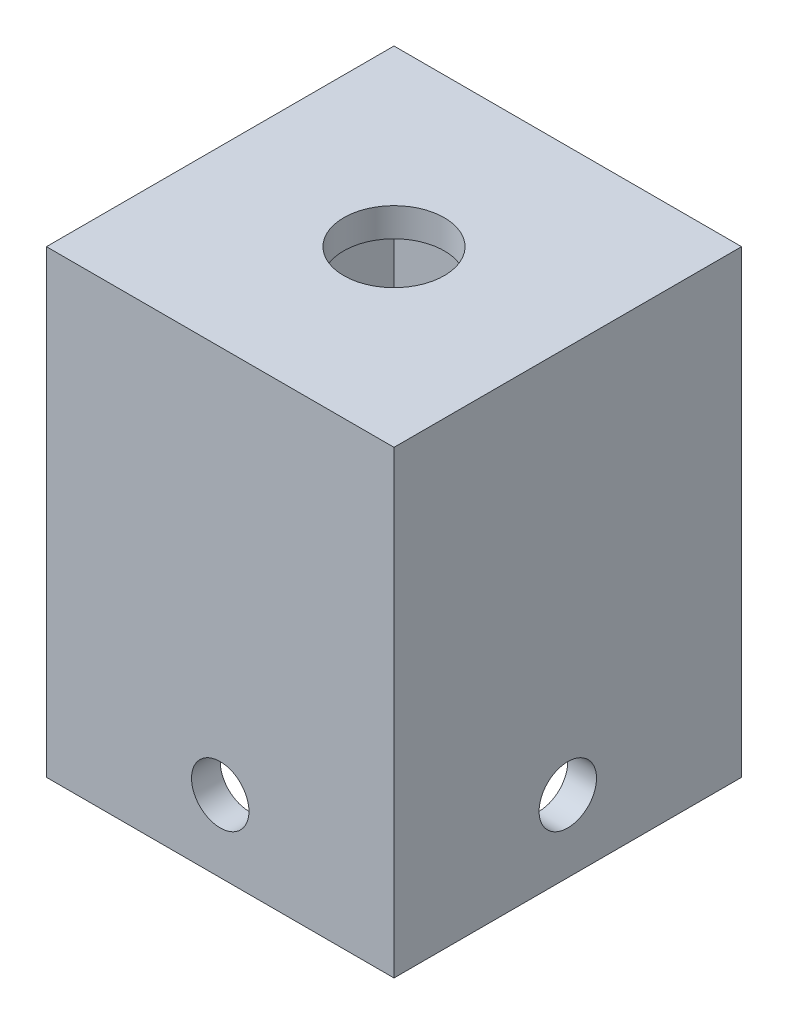
ISO-10303-21;
HEADER;
FILE_DESCRIPTION(('STEP AP214'),'2;1');
FILE_NAME('part.step','',(''),(''),'','','');
FILE_SCHEMA(('AUTOMOTIVE_DESIGN { 1 0 10303 214 1 1 1 1 }'));
ENDSEC;
DATA;
#1=APPLICATION_CONTEXT('core data for automotive mechanical design processes');
#2=APPLICATION_PROTOCOL_DEFINITION('international standard','automotive_design',2000,#1);
#3=PRODUCT_CONTEXT('',#1,'mechanical');
#4=PRODUCT('Part','Part','',(#3));
#5=PRODUCT_RELATED_PRODUCT_CATEGORY('part','',(#4));
#6=PRODUCT_DEFINITION_FORMATION('','',#4);
#7=PRODUCT_DEFINITION_CONTEXT('part definition',#1,'design');
#8=PRODUCT_DEFINITION('design','',#6,#7);
#9=PRODUCT_DEFINITION_SHAPE('','',#8);
#10=(LENGTH_UNIT() NAMED_UNIT(*) SI_UNIT(.MILLI.,.METRE.));
#11=(NAMED_UNIT(*) PLANE_ANGLE_UNIT() SI_UNIT($,.RADIAN.));
#12=(NAMED_UNIT(*) SI_UNIT($,.STERADIAN.) SOLID_ANGLE_UNIT());
#13=UNCERTAINTY_MEASURE_WITH_UNIT(LENGTH_MEASURE(1.E-05),#10,'distance_accuracy_value','');
#14=(GEOMETRIC_REPRESENTATION_CONTEXT(3) GLOBAL_UNCERTAINTY_ASSIGNED_CONTEXT((#13)) GLOBAL_UNIT_ASSIGNED_CONTEXT((#10,
#11,#12)) REPRESENTATION_CONTEXT('',''));
#15=CARTESIAN_POINT('',(0.,0.,0.));
#16=DIRECTION('',(0.,0.,1.));
#17=DIRECTION('',(1.,0.,0.));
#18=AXIS2_PLACEMENT_3D('',#15,#16,#17);
#19=CARTESIAN_POINT('',(0.,0.,0.));
#20=DIRECTION('',(0.,-1.,0.));
#21=DIRECTION('',(0.,0.,-1.));
#22=AXIS2_PLACEMENT_3D('',#19,#20,#21);
#23=PLANE('',#22);
#24=DIRECTION('',(0.,0.,1.));
#25=VECTOR('',#24,1.);
#26=CARTESIAN_POINT('',(-12.1,0.,-12.1));
#27=LINE('',#26,#25);
#28=CARTESIAN_POINT('',(-12.1,0.,-12.1));
#29=VERTEX_POINT('',#28);
#30=CARTESIAN_POINT('',(-12.1,0.,12.1));
#31=VERTEX_POINT('',#30);
#32=EDGE_CURVE('E111',#29,#31,#27,.T.);
#33=ORIENTED_EDGE('',*,*,#32,.F.);
#34=DIRECTION('',(-1.,0.,0.));
#35=VECTOR('',#34,1.);
#36=CARTESIAN_POINT('',(12.1,0.,-12.1));
#37=LINE('',#36,#35);
#38=CARTESIAN_POINT('',(12.1,0.,-12.1));
#39=VERTEX_POINT('',#38);
#40=EDGE_CURVE('E62',#39,#29,#37,.T.);
#41=ORIENTED_EDGE('',*,*,#40,.F.);
#42=DIRECTION('',(0.,0.,-1.));
#43=VECTOR('',#42,1.);
#44=CARTESIAN_POINT('',(12.1,0.,-12.1));
#45=LINE('',#44,#43);
#46=CARTESIAN_POINT('',(12.1,0.,12.1));
#47=VERTEX_POINT('',#46);
#48=EDGE_CURVE('E188',#47,#39,#45,.T.);
#49=ORIENTED_EDGE('',*,*,#48,.F.);
#50=DIRECTION('',(1.,0.,0.));
#51=VECTOR('',#50,1.);
#52=CARTESIAN_POINT('',(12.1,0.,12.1));
#53=LINE('',#52,#51);
#54=EDGE_CURVE('E186',#31,#47,#53,.T.);
#55=ORIENTED_EDGE('',*,*,#54,.F.);
#56=EDGE_LOOP('',(#33,#41,#49,#55));
#57=FACE_BOUND('',#56,.T.);
#58=DIRECTION('',(-1.,0.,0.));
#59=VECTOR('',#58,1.);
#60=CARTESIAN_POINT('',(10.1,0.,-10.1));
#61=LINE('',#60,#59);
#62=CARTESIAN_POINT('',(10.1,0.,-10.1));
#63=VERTEX_POINT('',#62);
#64=CARTESIAN_POINT('',(-10.1,0.,-10.1));
#65=VERTEX_POINT('',#64);
#66=EDGE_CURVE('E159',#63,#65,#61,.T.);
#67=ORIENTED_EDGE('',*,*,#66,.T.);
#68=DIRECTION('',(0.,0.,1.));
#69=VECTOR('',#68,1.);
#70=CARTESIAN_POINT('',(-10.1,0.,-10.1));
#71=LINE('',#70,#69);
#72=CARTESIAN_POINT('',(-10.1,0.,10.1));
#73=VERTEX_POINT('',#72);
#74=EDGE_CURVE('E54',#65,#73,#71,.T.);
#75=ORIENTED_EDGE('',*,*,#74,.T.);
#76=DIRECTION('',(1.,0.,0.));
#77=VECTOR('',#76,1.);
#78=CARTESIAN_POINT('',(10.1,0.,10.1));
#79=LINE('',#78,#77);
#80=CARTESIAN_POINT('',(10.1,0.,10.1));
#81=VERTEX_POINT('',#80);
#82=EDGE_CURVE('E170',#73,#81,#79,.T.);
#83=ORIENTED_EDGE('',*,*,#82,.T.);
#84=DIRECTION('',(0.,0.,-1.));
#85=VECTOR('',#84,1.);
#86=CARTESIAN_POINT('',(10.1,0.,-10.1));
#87=LINE('',#86,#85);
#88=EDGE_CURVE('E173',#81,#63,#87,.T.);
#89=ORIENTED_EDGE('',*,*,#88,.T.);
#90=EDGE_LOOP('',(#67,#75,#83,#89));
#91=FACE_BOUND('',#90,.T.);
#92=ADVANCED_FACE('F37',(#57,#91),#23,.T.);
#93=CARTESIAN_POINT('',(-12.1,30.,-12.1));
#94=DIRECTION('',(1.,0.,0.));
#95=DIRECTION('',(0.,0.,-1.));
#96=AXIS2_PLACEMENT_3D('',#93,#94,#95);
#97=PLANE('',#96);
#98=CARTESIAN_POINT('',(-12.1,5.,0.));
#99=DIRECTION('',(1.,0.,0.));
#100=DIRECTION('',(0.,0.,-1.));
#101=AXIS2_PLACEMENT_3D('',#98,#99,#100);
#102=CIRCLE('',#101,2.);
#103=CARTESIAN_POINT('',(-12.1,5.,-2.));
#104=VERTEX_POINT('',#103);
#105=EDGE_CURVE('E142',#104,#104,#102,.T.);
#106=ORIENTED_EDGE('',*,*,#105,.T.);
#107=EDGE_LOOP('',(#106));
#108=FACE_BOUND('',#107,.T.);
#109=ORIENTED_EDGE('',*,*,#32,.T.);
#110=DIRECTION('',(0.,-1.,0.));
#111=VECTOR('',#110,1.);
#112=CARTESIAN_POINT('',(-12.1,30.,12.1));
#113=LINE('',#112,#111);
#114=CARTESIAN_POINT('',(-12.1,32.,12.1));
#115=VERTEX_POINT('',#114);
#116=EDGE_CURVE('E11',#115,#31,#113,.T.);
#117=ORIENTED_EDGE('',*,*,#116,.F.);
#118=DIRECTION('',(0.,0.,1.));
#119=VECTOR('',#118,1.);
#120=CARTESIAN_POINT('',(-12.1,32.,-12.1));
#121=LINE('',#120,#119);
#122=CARTESIAN_POINT('',(-12.1,32.,-12.1));
#123=VERTEX_POINT('',#122);
#124=EDGE_CURVE('E109',#123,#115,#121,.T.);
#125=ORIENTED_EDGE('',*,*,#124,.F.);
#126=DIRECTION('',(0.,-1.,0.));
#127=VECTOR('',#126,1.);
#128=CARTESIAN_POINT('',(-12.1,30.,-12.1));
#129=LINE('',#128,#127);
#130=EDGE_CURVE('E191',#123,#29,#129,.T.);
#131=ORIENTED_EDGE('',*,*,#130,.T.);
#132=EDGE_LOOP('',(#109,#117,#125,#131));
#133=FACE_BOUND('',#132,.T.);
#134=ADVANCED_FACE('F39',(#108,#133),#97,.F.);
#135=CARTESIAN_POINT('',(12.1,30.,12.1));
#136=DIRECTION('',(0.,0.,-1.));
#137=DIRECTION('',(-1.,0.,0.));
#138=AXIS2_PLACEMENT_3D('',#135,#136,#137);
#139=PLANE('',#138);
#140=CARTESIAN_POINT('',(0.,5.,12.1));
#141=DIRECTION('',(0.,0.,1.));
#142=DIRECTION('',(1.,0.,0.));
#143=AXIS2_PLACEMENT_3D('',#140,#141,#142);
#144=CIRCLE('',#143,2.);
#145=CARTESIAN_POINT('',(2.,5.,12.1));
#146=VERTEX_POINT('',#145);
#147=EDGE_CURVE('E145',#146,#146,#144,.T.);
#148=ORIENTED_EDGE('',*,*,#147,.F.);
#149=EDGE_LOOP('',(#148));
#150=FACE_BOUND('',#149,.T.);
#151=ORIENTED_EDGE('',*,*,#54,.T.);
#152=DIRECTION('',(0.,-1.,0.));
#153=VECTOR('',#152,1.);
#154=CARTESIAN_POINT('',(12.1,30.,12.1));
#155=LINE('',#154,#153);
#156=CARTESIAN_POINT('',(12.1,32.,12.1));
#157=VERTEX_POINT('',#156);
#158=EDGE_CURVE('E46',#157,#47,#155,.T.);
#159=ORIENTED_EDGE('',*,*,#158,.F.);
#160=DIRECTION('',(1.,0.,0.));
#161=VECTOR('',#160,1.);
#162=CARTESIAN_POINT('',(12.1,32.,12.1));
#163=LINE('',#162,#161);
#164=EDGE_CURVE('E114',#115,#157,#163,.T.);
#165=ORIENTED_EDGE('',*,*,#164,.F.);
#166=ORIENTED_EDGE('',*,*,#116,.T.);
#167=EDGE_LOOP('',(#151,#159,#165,#166));
#168=FACE_BOUND('',#167,.T.);
#169=ADVANCED_FACE('F115',(#150,#168),#139,.F.);
#170=CARTESIAN_POINT('',(12.1,30.,-12.1));
#171=DIRECTION('',(-1.,0.,0.));
#172=DIRECTION('',(0.,0.,1.));
#173=AXIS2_PLACEMENT_3D('',#170,#171,#172);
#174=PLANE('',#173);
#175=CARTESIAN_POINT('',(12.1,5.,0.));
#176=DIRECTION('',(1.,0.,0.));
#177=DIRECTION('',(0.,0.,-1.));
#178=AXIS2_PLACEMENT_3D('',#175,#176,#177);
#179=CIRCLE('',#178,2.);
#180=CARTESIAN_POINT('',(12.1,5.,-2.));
#181=VERTEX_POINT('',#180);
#182=EDGE_CURVE('E136',#181,#181,#179,.T.);
#183=ORIENTED_EDGE('',*,*,#182,.F.);
#184=EDGE_LOOP('',(#183));
#185=FACE_BOUND('',#184,.T.);
#186=ORIENTED_EDGE('',*,*,#48,.T.);
#187=DIRECTION('',(0.,-1.,0.));
#188=VECTOR('',#187,1.);
#189=CARTESIAN_POINT('',(12.1,30.,-12.1));
#190=LINE('',#189,#188);
#191=CARTESIAN_POINT('',(12.1,32.,-12.1));
#192=VERTEX_POINT('',#191);
#193=EDGE_CURVE('E193',#192,#39,#190,.T.);
#194=ORIENTED_EDGE('',*,*,#193,.F.);
#195=DIRECTION('',(0.,0.,-1.));
#196=VECTOR('',#195,1.);
#197=CARTESIAN_POINT('',(12.1,32.,-12.1));
#198=LINE('',#197,#196);
#199=EDGE_CURVE('E120',#157,#192,#198,.T.);
#200=ORIENTED_EDGE('',*,*,#199,.F.);
#201=ORIENTED_EDGE('',*,*,#158,.T.);
#202=EDGE_LOOP('',(#186,#194,#200,#201));
#203=FACE_BOUND('',#202,.T.);
#204=ADVANCED_FACE('F228',(#185,#203),#174,.F.);
#205=CARTESIAN_POINT('',(12.1,30.,-12.1));
#206=DIRECTION('',(0.,0.,1.));
#207=DIRECTION('',(1.,0.,0.));
#208=AXIS2_PLACEMENT_3D('',#205,#206,#207);
#209=PLANE('',#208);
#210=CARTESIAN_POINT('',(0.,5.,-12.1));
#211=DIRECTION('',(0.,0.,1.));
#212=DIRECTION('',(1.,0.,0.));
#213=AXIS2_PLACEMENT_3D('',#210,#211,#212);
#214=CIRCLE('',#213,2.);
#215=CARTESIAN_POINT('',(2.,5.,-12.1));
#216=VERTEX_POINT('',#215);
#217=EDGE_CURVE('E152',#216,#216,#214,.T.);
#218=ORIENTED_EDGE('',*,*,#217,.T.);
#219=EDGE_LOOP('',(#218));
#220=FACE_BOUND('',#219,.T.);
#221=ORIENTED_EDGE('',*,*,#40,.T.);
#222=ORIENTED_EDGE('',*,*,#130,.F.);
#223=DIRECTION('',(-1.,0.,0.));
#224=VECTOR('',#223,1.);
#225=CARTESIAN_POINT('',(12.1,32.,-12.1));
#226=LINE('',#225,#224);
#227=EDGE_CURVE('E126',#192,#123,#226,.T.);
#228=ORIENTED_EDGE('',*,*,#227,.F.);
#229=ORIENTED_EDGE('',*,*,#193,.T.);
#230=EDGE_LOOP('',(#221,#222,#228,#229));
#231=FACE_BOUND('',#230,.T.);
#232=ADVANCED_FACE('F219',(#220,#231),#209,.F.);
#233=CARTESIAN_POINT('',(-10.1,30.,-10.1));
#234=DIRECTION('',(1.,0.,0.));
#235=DIRECTION('',(0.,0.,-1.));
#236=AXIS2_PLACEMENT_3D('',#233,#234,#235);
#237=PLANE('',#236);
#238=CARTESIAN_POINT('',(-10.1,5.,0.));
#239=DIRECTION('',(1.,0.,0.));
#240=DIRECTION('',(0.,0.,-1.));
#241=AXIS2_PLACEMENT_3D('',#238,#239,#240);
#242=CIRCLE('',#241,2.);
#243=CARTESIAN_POINT('',(-10.1,5.,-2.));
#244=VERTEX_POINT('',#243);
#245=EDGE_CURVE('E139',#244,#244,#242,.T.);
#246=ORIENTED_EDGE('',*,*,#245,.F.);
#247=EDGE_LOOP('',(#246));
#248=FACE_BOUND('',#247,.T.);
#249=ORIENTED_EDGE('',*,*,#74,.F.);
#250=DIRECTION('',(0.,-1.,0.));
#251=VECTOR('',#250,1.);
#252=CARTESIAN_POINT('',(-10.1,30.,-10.1));
#253=LINE('',#252,#251);
#254=CARTESIAN_POINT('',(-10.1,30.,-10.1));
#255=VERTEX_POINT('',#254);
#256=EDGE_CURVE('E168',#255,#65,#253,.T.);
#257=ORIENTED_EDGE('',*,*,#256,.F.);
#258=DIRECTION('',(0.,0.,1.));
#259=VECTOR('',#258,1.);
#260=CARTESIAN_POINT('',(-10.1,30.,-10.1));
#261=LINE('',#260,#259);
#262=CARTESIAN_POINT('',(-10.1,30.,10.1));
#263=VERTEX_POINT('',#262);
#264=EDGE_CURVE('E155',#255,#263,#261,.T.);
#265=ORIENTED_EDGE('',*,*,#264,.T.);
#266=DIRECTION('',(0.,-1.,0.));
#267=VECTOR('',#266,1.);
#268=CARTESIAN_POINT('',(-10.1,30.,10.1));
#269=LINE('',#268,#267);
#270=EDGE_CURVE('E183',#263,#73,#269,.T.);
#271=ORIENTED_EDGE('',*,*,#270,.T.);
#272=EDGE_LOOP('',(#249,#257,#265,#271));
#273=FACE_BOUND('',#272,.T.);
#274=ADVANCED_FACE('F217',(#248,#273),#237,.T.);
#275=CARTESIAN_POINT('',(10.1,30.,10.1));
#276=DIRECTION('',(0.,0.,-1.));
#277=DIRECTION('',(-1.,0.,0.));
#278=AXIS2_PLACEMENT_3D('',#275,#276,#277);
#279=PLANE('',#278);
#280=CARTESIAN_POINT('',(0.,5.,10.1));
#281=DIRECTION('',(0.,0.,-1.));
#282=DIRECTION('',(-1.,0.,0.));
#283=AXIS2_PLACEMENT_3D('',#280,#281,#282);
#284=CIRCLE('',#283,2.);
#285=CARTESIAN_POINT('',(-2.,5.,10.1));
#286=VERTEX_POINT('',#285);
#287=EDGE_CURVE('E149',#286,#286,#284,.T.);
#288=ORIENTED_EDGE('',*,*,#287,.F.);
#289=EDGE_LOOP('',(#288));
#290=FACE_BOUND('',#289,.T.);
#291=ORIENTED_EDGE('',*,*,#82,.F.);
#292=ORIENTED_EDGE('',*,*,#270,.F.);
#293=DIRECTION('',(1.,0.,0.));
#294=VECTOR('',#293,1.);
#295=CARTESIAN_POINT('',(10.1,30.,10.1));
#296=LINE('',#295,#294);
#297=CARTESIAN_POINT('',(10.1,30.,10.1));
#298=VERTEX_POINT('',#297);
#299=EDGE_CURVE('E158',#263,#298,#296,.T.);
#300=ORIENTED_EDGE('',*,*,#299,.T.);
#301=DIRECTION('',(0.,-1.,0.));
#302=VECTOR('',#301,1.);
#303=CARTESIAN_POINT('',(10.1,30.,10.1));
#304=LINE('',#303,#302);
#305=EDGE_CURVE('E181',#298,#81,#304,.T.);
#306=ORIENTED_EDGE('',*,*,#305,.T.);
#307=EDGE_LOOP('',(#291,#292,#300,#306));
#308=FACE_BOUND('',#307,.T.);
#309=ADVANCED_FACE('F216',(#290,#308),#279,.T.);
#310=CARTESIAN_POINT('',(10.1,30.,-10.1));
#311=DIRECTION('',(-1.,0.,0.));
#312=DIRECTION('',(0.,0.,1.));
#313=AXIS2_PLACEMENT_3D('',#310,#311,#312);
#314=PLANE('',#313);
#315=CARTESIAN_POINT('',(10.1,5.,0.));
#316=DIRECTION('',(-1.,0.,0.));
#317=DIRECTION('',(0.,0.,1.));
#318=AXIS2_PLACEMENT_3D('',#315,#316,#317);
#319=CIRCLE('',#318,2.);
#320=CARTESIAN_POINT('',(10.1,5.,2.));
#321=VERTEX_POINT('',#320);
#322=EDGE_CURVE('E41',#321,#321,#319,.T.);
#323=ORIENTED_EDGE('',*,*,#322,.F.);
#324=EDGE_LOOP('',(#323));
#325=FACE_BOUND('',#324,.T.);
#326=ORIENTED_EDGE('',*,*,#88,.F.);
#327=ORIENTED_EDGE('',*,*,#305,.F.);
#328=DIRECTION('',(0.,0.,-1.));
#329=VECTOR('',#328,1.);
#330=CARTESIAN_POINT('',(10.1,30.,-10.1));
#331=LINE('',#330,#329);
#332=CARTESIAN_POINT('',(10.1,30.,-10.1));
#333=VERTEX_POINT('',#332);
#334=EDGE_CURVE('E162',#298,#333,#331,.T.);
#335=ORIENTED_EDGE('',*,*,#334,.T.);
#336=DIRECTION('',(0.,-1.,0.));
#337=VECTOR('',#336,1.);
#338=CARTESIAN_POINT('',(10.1,30.,-10.1));
#339=LINE('',#338,#337);
#340=EDGE_CURVE('E179',#333,#63,#339,.T.);
#341=ORIENTED_EDGE('',*,*,#340,.T.);
#342=EDGE_LOOP('',(#326,#327,#335,#341));
#343=FACE_BOUND('',#342,.T.);
#344=ADVANCED_FACE('F204',(#325,#343),#314,.T.);
#345=CARTESIAN_POINT('',(10.1,30.,-10.1));
#346=DIRECTION('',(0.,0.,1.));
#347=DIRECTION('',(1.,0.,0.));
#348=AXIS2_PLACEMENT_3D('',#345,#346,#347);
#349=PLANE('',#348);
#350=CARTESIAN_POINT('',(0.,5.,-10.1));
#351=DIRECTION('',(0.,0.,1.));
#352=DIRECTION('',(1.,0.,0.));
#353=AXIS2_PLACEMENT_3D('',#350,#351,#352);
#354=CIRCLE('',#353,2.);
#355=CARTESIAN_POINT('',(2.,5.,-10.1));
#356=VERTEX_POINT('',#355);
#357=EDGE_CURVE('E148',#356,#356,#354,.T.);
#358=ORIENTED_EDGE('',*,*,#357,.F.);
#359=EDGE_LOOP('',(#358));
#360=FACE_BOUND('',#359,.T.);
#361=ORIENTED_EDGE('',*,*,#66,.F.);
#362=ORIENTED_EDGE('',*,*,#340,.F.);
#363=DIRECTION('',(-1.,0.,0.));
#364=VECTOR('',#363,1.);
#365=CARTESIAN_POINT('',(10.1,30.,-10.1));
#366=LINE('',#365,#364);
#367=EDGE_CURVE('E165',#333,#255,#366,.T.);
#368=ORIENTED_EDGE('',*,*,#367,.T.);
#369=ORIENTED_EDGE('',*,*,#256,.T.);
#370=EDGE_LOOP('',(#361,#362,#368,#369));
#371=FACE_BOUND('',#370,.T.);
#372=ADVANCED_FACE('F201',(#360,#371),#349,.T.);
#373=CARTESIAN_POINT('',(0.,5.,-17.9));
#374=DIRECTION('',(0.,0.,1.));
#375=DIRECTION('',(1.,0.,0.));
#376=AXIS2_PLACEMENT_3D('',#373,#374,#375);
#377=CYLINDRICAL_SURFACE('',#376,2.);
#378=ORIENTED_EDGE('',*,*,#357,.T.);
#379=EDGE_LOOP('',(#378));
#380=FACE_BOUND('',#379,.T.);
#381=ORIENTED_EDGE('',*,*,#217,.F.);
#382=EDGE_LOOP('',(#381));
#383=FACE_BOUND('',#382,.T.);
#384=ADVANCED_FACE('F198',(#380,#383),#377,.F.);
#385=ORIENTED_EDGE('',*,*,#287,.T.);
#386=EDGE_LOOP('',(#385));
#387=FACE_BOUND('',#386,.T.);
#388=ORIENTED_EDGE('',*,*,#147,.T.);
#389=EDGE_LOOP('',(#388));
#390=FACE_BOUND('',#389,.T.);
#391=ADVANCED_FACE('F248',(#387,#390),#377,.F.);
#392=CARTESIAN_POINT('',(-17.9,5.,0.));
#393=DIRECTION('',(1.,0.,0.));
#394=DIRECTION('',(0.,0.,-1.));
#395=AXIS2_PLACEMENT_3D('',#392,#393,#394);
#396=CYLINDRICAL_SURFACE('',#395,2.);
#397=ORIENTED_EDGE('',*,*,#322,.T.);
#398=EDGE_LOOP('',(#397));
#399=FACE_BOUND('',#398,.T.);
#400=ORIENTED_EDGE('',*,*,#182,.T.);
#401=EDGE_LOOP('',(#400));
#402=FACE_BOUND('',#401,.T.);
#403=ADVANCED_FACE('F250',(#399,#402),#396,.F.);
#404=ORIENTED_EDGE('',*,*,#245,.T.);
#405=EDGE_LOOP('',(#404));
#406=FACE_BOUND('',#405,.T.);
#407=ORIENTED_EDGE('',*,*,#105,.F.);
#408=EDGE_LOOP('',(#407));
#409=FACE_BOUND('',#408,.T.);
#410=ADVANCED_FACE('F257',(#406,#409),#396,.F.);
#411=CARTESIAN_POINT('',(0.,30.,0.));
#412=DIRECTION('',(0.,-1.,0.));
#413=DIRECTION('',(0.,0.,-1.));
#414=AXIS2_PLACEMENT_3D('',#411,#412,#413);
#415=PLANE('',#414);
#416=CARTESIAN_POINT('',(0.,30.,0.));
#417=DIRECTION('',(0.,1.,0.));
#418=DIRECTION('',(0.,0.,1.));
#419=AXIS2_PLACEMENT_3D('',#416,#417,#418);
#420=CIRCLE('',#419,3.5);
#421=CARTESIAN_POINT('',(0.,30.,3.5));
#422=VERTEX_POINT('',#421);
#423=EDGE_CURVE('E130',#422,#422,#420,.T.);
#424=ORIENTED_EDGE('',*,*,#423,.T.);
#425=EDGE_LOOP('',(#424));
#426=FACE_BOUND('',#425,.T.);
#427=ORIENTED_EDGE('',*,*,#264,.F.);
#428=ORIENTED_EDGE('',*,*,#367,.F.);
#429=ORIENTED_EDGE('',*,*,#334,.F.);
#430=ORIENTED_EDGE('',*,*,#299,.F.);
#431=EDGE_LOOP('',(#427,#428,#429,#430));
#432=FACE_BOUND('',#431,.T.);
#433=ADVANCED_FACE('F213',(#426,#432),#415,.T.);
#434=CARTESIAN_POINT('',(0.,32.,0.));
#435=DIRECTION('',(0.,-1.,0.));
#436=DIRECTION('',(0.,0.,-1.));
#437=AXIS2_PLACEMENT_3D('',#434,#435,#436);
#438=PLANE('',#437);
#439=ORIENTED_EDGE('',*,*,#124,.T.);
#440=ORIENTED_EDGE('',*,*,#164,.T.);
#441=ORIENTED_EDGE('',*,*,#199,.T.);
#442=ORIENTED_EDGE('',*,*,#227,.T.);
#443=EDGE_LOOP('',(#439,#440,#441,#442));
#444=FACE_BOUND('',#443,.T.);
#445=CARTESIAN_POINT('',(0.,32.,0.));
#446=DIRECTION('',(0.,1.,0.));
#447=DIRECTION('',(0.,0.,1.));
#448=AXIS2_PLACEMENT_3D('',#445,#446,#447);
#449=CIRCLE('',#448,3.5);
#450=CARTESIAN_POINT('',(0.,32.,3.5));
#451=VERTEX_POINT('',#450);
#452=EDGE_CURVE('E127',#451,#451,#449,.T.);
#453=ORIENTED_EDGE('',*,*,#452,.F.);
#454=EDGE_LOOP('',(#453));
#455=FACE_BOUND('',#454,.T.);
#456=ADVANCED_FACE('F123',(#444,#455),#438,.F.);
#457=CARTESIAN_POINT('',(0.,32.,0.));
#458=DIRECTION('',(0.,-1.,0.));
#459=DIRECTION('',(0.,0.,-1.));
#460=AXIS2_PLACEMENT_3D('',#457,#458,#459);
#461=CYLINDRICAL_SURFACE('',#460,3.5);
#462=ORIENTED_EDGE('',*,*,#452,.T.);
#463=EDGE_LOOP('',(#462));
#464=FACE_BOUND('',#463,.T.);
#465=ORIENTED_EDGE('',*,*,#423,.F.);
#466=EDGE_LOOP('',(#465));
#467=FACE_BOUND('',#466,.T.);
#468=ADVANCED_FACE('F372',(#464,#467),#461,.F.);
#469=CLOSED_SHELL('',(#92,#134,#169,#204,#232,#274,#309,#344,#372,#384,#391,#403,#410,#433,#456,#468));
#470=MANIFOLD_SOLID_BREP('B2',#469);
#471=ADVANCED_BREP_SHAPE_REPRESENTATION('',(#18,#470),#14);
#472=SHAPE_DEFINITION_REPRESENTATION(#9,#471);
ENDSEC;
END-ISO-10303-21;
